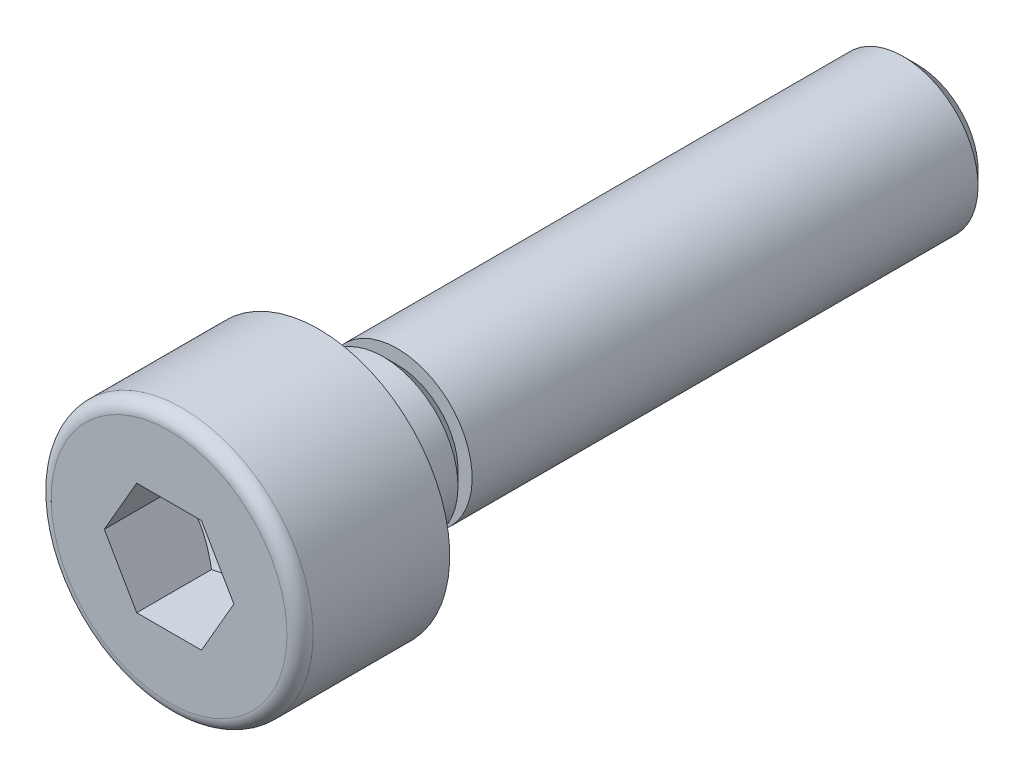
ISO-10303-21;
HEADER;
FILE_DESCRIPTION(('STEP AP214'),'2;1');
FILE_NAME('part.step','',(''),(''),'','','');
FILE_SCHEMA(('AUTOMOTIVE_DESIGN { 1 0 10303 214 1 1 1 1 }'));
ENDSEC;
DATA;
#1=APPLICATION_CONTEXT('core data for automotive mechanical design processes');
#2=APPLICATION_PROTOCOL_DEFINITION('international standard','automotive_design',2000,#1);
#3=PRODUCT_CONTEXT('',#1,'mechanical');
#4=PRODUCT('Part','Part','',(#3));
#5=PRODUCT_RELATED_PRODUCT_CATEGORY('part','',(#4));
#6=PRODUCT_DEFINITION_FORMATION('','',#4);
#7=PRODUCT_DEFINITION_CONTEXT('part definition',#1,'design');
#8=PRODUCT_DEFINITION('design','',#6,#7);
#9=PRODUCT_DEFINITION_SHAPE('','',#8);
#10=(LENGTH_UNIT() NAMED_UNIT(*) SI_UNIT(.MILLI.,.METRE.));
#11=(NAMED_UNIT(*) PLANE_ANGLE_UNIT() SI_UNIT($,.RADIAN.));
#12=(NAMED_UNIT(*) SI_UNIT($,.STERADIAN.) SOLID_ANGLE_UNIT());
#13=UNCERTAINTY_MEASURE_WITH_UNIT(LENGTH_MEASURE(1.E-05),#10,'distance_accuracy_value','');
#14=(GEOMETRIC_REPRESENTATION_CONTEXT(3) GLOBAL_UNCERTAINTY_ASSIGNED_CONTEXT((#13)) GLOBAL_UNIT_ASSIGNED_CONTEXT((#10,
#11,#12)) REPRESENTATION_CONTEXT('',''));
#15=CARTESIAN_POINT('',(0.,0.,0.));
#16=DIRECTION('',(0.,0.,1.));
#17=DIRECTION('',(1.,0.,0.));
#18=AXIS2_PLACEMENT_3D('',#15,#16,#17);
#19=CARTESIAN_POINT('',(0.,1.575,4.));
#20=DIRECTION('',(0.,0.,1.));
#21=DIRECTION('',(0.,-1.,0.));
#22=AXIS2_PLACEMENT_3D('',#19,#20,#21);
#23=PLANE('',#22);
#24=CARTESIAN_POINT('',(0.,0.,4.));
#25=DIRECTION('',(0.,0.,-1.));
#26=DIRECTION('',(0.,1.,0.));
#27=AXIS2_PLACEMENT_3D('',#24,#25,#26);
#28=CIRCLE('',#27,3.15);
#29=CARTESIAN_POINT('',(0.,3.15,4.));
#30=VERTEX_POINT('',#29);
#31=EDGE_CURVE('E186',#30,#30,#28,.T.);
#32=ORIENTED_EDGE('',*,*,#31,.F.);
#33=EDGE_LOOP('',(#32));
#34=FACE_BOUND('',#33,.T.);
#35=DIRECTION('',(-0.5,0.866025403784439,0.));
#36=VECTOR('',#35,1.);
#37=CARTESIAN_POINT('',(-1.64003500274012,-0.159374650312418,4.));
#38=LINE('',#37,#36);
#39=CARTESIAN_POINT('',(-0.866025,-1.49999930062484,4.));
#40=VERTEX_POINT('',#39);
#41=CARTESIAN_POINT('',(-1.73205,0.,4.));
#42=VERTEX_POINT('',#41);
#43=EDGE_CURVE('E100',#40,#42,#38,.T.);
#44=ORIENTED_EDGE('',*,*,#43,.T.);
#45=DIRECTION('',(0.5,0.866025403784439,0.));
#46=VECTOR('',#45,1.);
#47=CARTESIAN_POINT('',(-0.958039997259878,1.34062465031242,4.));
#48=LINE('',#47,#46);
#49=CARTESIAN_POINT('',(-0.866025,1.49999930062484,4.));
#50=VERTEX_POINT('',#49);
#51=EDGE_CURVE('E182',#42,#50,#48,.T.);
#52=ORIENTED_EDGE('',*,*,#51,.T.);
#53=DIRECTION('',(1.,0.,0.));
#54=VECTOR('',#53,1.);
#55=CARTESIAN_POINT('',(0.,1.49999930062484,4.));
#56=LINE('',#55,#54);
#57=CARTESIAN_POINT('',(0.866025,1.49999930062484,4.));
#58=VERTEX_POINT('',#57);
#59=EDGE_CURVE('E171',#50,#58,#56,.T.);
#60=ORIENTED_EDGE('',*,*,#59,.T.);
#61=DIRECTION('',(0.5,-0.866025403784439,0.));
#62=VECTOR('',#61,1.);
#63=CARTESIAN_POINT('',(0.958039997259877,1.34062465031242,4.));
#64=LINE('',#63,#62);
#65=CARTESIAN_POINT('',(1.73205,0.,4.));
#66=VERTEX_POINT('',#65);
#67=EDGE_CURVE('E178',#58,#66,#64,.T.);
#68=ORIENTED_EDGE('',*,*,#67,.T.);
#69=DIRECTION('',(-0.5,-0.866025403784439,0.));
#70=VECTOR('',#69,1.);
#71=CARTESIAN_POINT('',(1.64003500274012,-0.159374650312418,4.));
#72=LINE('',#71,#70);
#73=CARTESIAN_POINT('',(0.866025,-1.49999930062484,4.));
#74=VERTEX_POINT('',#73);
#75=EDGE_CURVE('E103',#66,#74,#72,.T.);
#76=ORIENTED_EDGE('',*,*,#75,.T.);
#77=DIRECTION('',(-1.,0.,0.));
#78=VECTOR('',#77,1.);
#79=CARTESIAN_POINT('',(0.,-1.49999930062484,4.));
#80=LINE('',#79,#78);
#81=EDGE_CURVE('E97',#74,#40,#80,.T.);
#82=ORIENTED_EDGE('',*,*,#81,.T.);
#83=EDGE_LOOP('',(#44,#52,#60,#68,#76,#82));
#84=FACE_BOUND('',#83,.T.);
#85=ADVANCED_FACE('F17',(#34,#84),#23,.T.);
#86=CARTESIAN_POINT('',(0.,0.8105625,-16.));
#87=DIRECTION('',(0.,0.,-1.));
#88=DIRECTION('',(0.,1.,0.));
#89=AXIS2_PLACEMENT_3D('',#86,#87,#88);
#90=PLANE('',#89);
#91=CARTESIAN_POINT('',(0.,0.,-16.));
#92=DIRECTION('',(0.,0.,-1.));
#93=DIRECTION('',(0.,1.,0.));
#94=AXIS2_PLACEMENT_3D('',#91,#92,#93);
#95=CIRCLE('',#94,1.621125);
#96=CARTESIAN_POINT('',(0.,1.621125,-16.));
#97=VERTEX_POINT('',#96);
#98=EDGE_CURVE('E11',#97,#97,#95,.T.);
#99=ORIENTED_EDGE('',*,*,#98,.T.);
#100=EDGE_LOOP('',(#99));
#101=FACE_BOUND('',#100,.T.);
#102=ADVANCED_FACE('F219',(#101),#90,.T.);
#103=CARTESIAN_POINT('',(0.,0.,-15.8105625));
#104=DIRECTION('',(0.,0.,1.));
#105=DIRECTION('',(0.,1.,0.));
#106=AXIS2_PLACEMENT_3D('',#103,#104,#105);
#107=CONICAL_SURFACE('',#106,1.8105625,0.785398163397448);
#108=CARTESIAN_POINT('',(0.,0.,-15.621125));
#109=DIRECTION('',(0.,0.,-1.));
#110=DIRECTION('',(0.,1.,0.));
#111=AXIS2_PLACEMENT_3D('',#108,#109,#110);
#112=CIRCLE('',#111,2.);
#113=CARTESIAN_POINT('',(0.,2.,-15.621125));
#114=VERTEX_POINT('',#113);
#115=EDGE_CURVE('E24',#114,#114,#112,.T.);
#116=ORIENTED_EDGE('',*,*,#115,.T.);
#117=EDGE_LOOP('',(#116));
#118=FACE_BOUND('',#117,.T.);
#119=ORIENTED_EDGE('',*,*,#98,.F.);
#120=EDGE_LOOP('',(#119));
#121=FACE_BOUND('',#120,.T.);
#122=ADVANCED_FACE('F224',(#118,#121),#107,.T.);
#123=CARTESIAN_POINT('',(0.,0.,-8.8605625));
#124=DIRECTION('',(0.,0.,1.));
#125=DIRECTION('',(0.,1.,0.));
#126=AXIS2_PLACEMENT_3D('',#123,#124,#125);
#127=CYLINDRICAL_SURFACE('',#126,2.);
#128=CARTESIAN_POINT('',(0.,0.,-2.1));
#129=DIRECTION('',(0.,0.,-1.));
#130=DIRECTION('',(0.,1.,0.));
#131=AXIS2_PLACEMENT_3D('',#128,#129,#130);
#132=CIRCLE('',#131,2.);
#133=CARTESIAN_POINT('',(0.,2.,-2.1));
#134=VERTEX_POINT('',#133);
#135=EDGE_CURVE('E123',#134,#134,#132,.T.);
#136=ORIENTED_EDGE('',*,*,#135,.T.);
#137=EDGE_LOOP('',(#136));
#138=FACE_BOUND('',#137,.T.);
#139=ORIENTED_EDGE('',*,*,#115,.F.);
#140=EDGE_LOOP('',(#139));
#141=FACE_BOUND('',#140,.T.);
#142=ADVANCED_FACE('F214',(#138,#141),#127,.T.);
#143=CARTESIAN_POINT('',(0.,1.8105625,-2.1));
#144=DIRECTION('',(0.,0.,1.));
#145=DIRECTION('',(0.,-1.,0.));
#146=AXIS2_PLACEMENT_3D('',#143,#144,#145);
#147=PLANE('',#146);
#148=CARTESIAN_POINT('',(0.,0.,-2.1));
#149=DIRECTION('',(0.,0.,-1.));
#150=DIRECTION('',(0.,1.,0.));
#151=AXIS2_PLACEMENT_3D('',#148,#149,#150);
#152=CIRCLE('',#151,1.621125);
#153=CARTESIAN_POINT('',(0.,1.621125,-2.1));
#154=VERTEX_POINT('',#153);
#155=EDGE_CURVE('E125',#154,#154,#152,.T.);
#156=ORIENTED_EDGE('',*,*,#155,.T.);
#157=EDGE_LOOP('',(#156));
#158=FACE_BOUND('',#157,.T.);
#159=ORIENTED_EDGE('',*,*,#135,.F.);
#160=EDGE_LOOP('',(#159));
#161=FACE_BOUND('',#160,.T.);
#162=ADVANCED_FACE('F198',(#158,#161),#147,.T.);
#163=CARTESIAN_POINT('',(0.,0.,-1.9105625));
#164=DIRECTION('',(0.,0.,1.));
#165=DIRECTION('',(0.,1.,0.));
#166=AXIS2_PLACEMENT_3D('',#163,#164,#165);
#167=CONICAL_SURFACE('',#166,1.8105625,0.785398163397449);
#168=CARTESIAN_POINT('',(0.,0.,-1.721125));
#169=DIRECTION('',(0.,0.,-1.));
#170=DIRECTION('',(0.,1.,0.));
#171=AXIS2_PLACEMENT_3D('',#168,#169,#170);
#172=CIRCLE('',#171,2.);
#173=CARTESIAN_POINT('',(0.,2.,-1.721125));
#174=VERTEX_POINT('',#173);
#175=EDGE_CURVE('E194',#174,#174,#172,.T.);
#176=ORIENTED_EDGE('',*,*,#175,.T.);
#177=EDGE_LOOP('',(#176));
#178=FACE_BOUND('',#177,.T.);
#179=ORIENTED_EDGE('',*,*,#155,.F.);
#180=EDGE_LOOP('',(#179));
#181=FACE_BOUND('',#180,.T.);
#182=ADVANCED_FACE('F201',(#178,#181),#167,.T.);
#183=CARTESIAN_POINT('',(0.,0.,-0.9605625));
#184=DIRECTION('',(0.,0.,1.));
#185=DIRECTION('',(0.,1.,0.));
#186=AXIS2_PLACEMENT_3D('',#183,#184,#185);
#187=CYLINDRICAL_SURFACE('',#186,2.);
#188=CARTESIAN_POINT('',(0.,0.,-0.2));
#189=DIRECTION('',(0.,0.,-1.));
#190=DIRECTION('',(0.,1.,0.));
#191=AXIS2_PLACEMENT_3D('',#188,#189,#190);
#192=CIRCLE('',#191,2.);
#193=CARTESIAN_POINT('',(0.,2.,-0.2));
#194=VERTEX_POINT('',#193);
#195=EDGE_CURVE('E192',#194,#194,#192,.T.);
#196=ORIENTED_EDGE('',*,*,#195,.T.);
#197=EDGE_LOOP('',(#196));
#198=FACE_BOUND('',#197,.T.);
#199=ORIENTED_EDGE('',*,*,#175,.F.);
#200=EDGE_LOOP('',(#199));
#201=FACE_BOUND('',#200,.T.);
#202=ADVANCED_FACE('F203',(#198,#201),#187,.T.);
#203=CARTESIAN_POINT('',(0.,0.,-0.2));
#204=DIRECTION('',(0.,0.,-1.));
#205=DIRECTION('',(-1.,0.,0.));
#206=AXIS2_PLACEMENT_3D('',#203,#204,#205);
#207=TOROIDAL_SURFACE('',#206,2.2,0.2);
#208=CARTESIAN_POINT('',(0.,0.,0.));
#209=DIRECTION('',(0.,0.,-1.));
#210=DIRECTION('',(0.,1.,0.));
#211=AXIS2_PLACEMENT_3D('',#208,#209,#210);
#212=CIRCLE('',#211,2.2);
#213=CARTESIAN_POINT('',(0.,2.2,0.));
#214=VERTEX_POINT('',#213);
#215=EDGE_CURVE('E190',#214,#214,#212,.T.);
#216=ORIENTED_EDGE('',*,*,#215,.T.);
#217=EDGE_LOOP('',(#216));
#218=FACE_BOUND('',#217,.T.);
#219=ORIENTED_EDGE('',*,*,#195,.F.);
#220=EDGE_LOOP('',(#219));
#221=FACE_BOUND('',#220,.T.);
#222=ADVANCED_FACE('F211',(#218,#221),#207,.F.);
#223=CARTESIAN_POINT('',(0.,2.85,0.));
#224=DIRECTION('',(0.,0.,-1.));
#225=DIRECTION('',(0.,1.,0.));
#226=AXIS2_PLACEMENT_3D('',#223,#224,#225);
#227=PLANE('',#226);
#228=CARTESIAN_POINT('',(0.,0.,0.));
#229=DIRECTION('',(0.,0.,-1.));
#230=DIRECTION('',(0.,1.,0.));
#231=AXIS2_PLACEMENT_3D('',#228,#229,#230);
#232=CIRCLE('',#231,3.5);
#233=CARTESIAN_POINT('',(0.,3.5,0.));
#234=VERTEX_POINT('',#233);
#235=EDGE_CURVE('E188',#234,#234,#232,.T.);
#236=ORIENTED_EDGE('',*,*,#235,.T.);
#237=EDGE_LOOP('',(#236));
#238=FACE_BOUND('',#237,.T.);
#239=ORIENTED_EDGE('',*,*,#215,.F.);
#240=EDGE_LOOP('',(#239));
#241=FACE_BOUND('',#240,.T.);
#242=ADVANCED_FACE('F237',(#238,#241),#227,.T.);
#243=CARTESIAN_POINT('',(0.,0.,1.825));
#244=DIRECTION('',(0.,0.,1.));
#245=DIRECTION('',(0.,1.,0.));
#246=AXIS2_PLACEMENT_3D('',#243,#244,#245);
#247=CYLINDRICAL_SURFACE('',#246,3.5);
#248=CARTESIAN_POINT('',(0.,0.,3.65));
#249=DIRECTION('',(0.,0.,-1.));
#250=DIRECTION('',(0.,1.,0.));
#251=AXIS2_PLACEMENT_3D('',#248,#249,#250);
#252=CIRCLE('',#251,3.5);
#253=CARTESIAN_POINT('',(0.,3.5,3.65));
#254=VERTEX_POINT('',#253);
#255=EDGE_CURVE('E184',#254,#254,#252,.T.);
#256=ORIENTED_EDGE('',*,*,#255,.T.);
#257=EDGE_LOOP('',(#256));
#258=FACE_BOUND('',#257,.T.);
#259=ORIENTED_EDGE('',*,*,#235,.F.);
#260=EDGE_LOOP('',(#259));
#261=FACE_BOUND('',#260,.T.);
#262=ADVANCED_FACE('F231',(#258,#261),#247,.T.);
#263=CARTESIAN_POINT('',(0.,0.,3.65));
#264=DIRECTION('',(0.,0.,-1.));
#265=DIRECTION('',(-1.,0.,0.));
#266=AXIS2_PLACEMENT_3D('',#263,#264,#265);
#267=TOROIDAL_SURFACE('',#266,3.15,0.35);
#268=ORIENTED_EDGE('',*,*,#31,.T.);
#269=EDGE_LOOP('',(#268));
#270=FACE_BOUND('',#269,.T.);
#271=ORIENTED_EDGE('',*,*,#255,.F.);
#272=EDGE_LOOP('',(#271));
#273=FACE_BOUND('',#272,.T.);
#274=ADVANCED_FACE('F227',(#270,#273),#267,.T.);
#275=CARTESIAN_POINT('',(-1.2990375,0.749999650312418,4.));
#276=DIRECTION('',(-0.866025403784439,0.5,0.));
#277=DIRECTION('',(0.5,0.866025403784439,0.));
#278=AXIS2_PLACEMENT_3D('',#275,#276,#277);
#279=PLANE('',#278);
#280=CARTESIAN_POINT('',(-1.73205,0.,2.));
#281=CARTESIAN_POINT('',(-1.2990375,0.749999650312417,1.75000011656253));
#282=CARTESIAN_POINT('',(-0.866025,1.49999930062484,2.));
#283=(BOUNDED_CURVE() B_SPLINE_CURVE(2,(#280,#281,#282),.UNSPECIFIED.,.F.,
.F.) B_SPLINE_CURVE_WITH_KNOTS((3,3),(0.,1.75265338994166),
.UNSPECIFIED.) CURVE() GEOMETRIC_REPRESENTATION_ITEM() RATIONAL_B_SPLINE_CURVE((1.,
1.15470053837925,1.)) REPRESENTATION_ITEM(''));
#284=CARTESIAN_POINT('',(-1.73205,0.,2.));
#285=VERTEX_POINT('',#284);
#286=CARTESIAN_POINT('',(-0.866025,1.49999930062484,2.));
#287=VERTEX_POINT('',#286);
#288=EDGE_CURVE('E145',#285,#287,#283,.T.);
#289=ORIENTED_EDGE('',*,*,#288,.T.);
#290=DIRECTION('',(0.,0.,-1.));
#291=VECTOR('',#290,1.);
#292=CARTESIAN_POINT('',(-0.866025,1.49999930062484,4.));
#293=LINE('',#292,#291);
#294=EDGE_CURVE('E172',#50,#287,#293,.T.);
#295=ORIENTED_EDGE('',*,*,#294,.F.);
#296=ORIENTED_EDGE('',*,*,#51,.F.);
#297=DIRECTION('',(0.,0.,-1.));
#298=VECTOR('',#297,1.);
#299=CARTESIAN_POINT('',(-1.73205,0.,4.));
#300=LINE('',#299,#298);
#301=EDGE_CURVE('E118',#42,#285,#300,.T.);
#302=ORIENTED_EDGE('',*,*,#301,.T.);
#303=EDGE_LOOP('',(#289,#295,#296,#302));
#304=FACE_BOUND('',#303,.T.);
#305=ADVANCED_FACE('F230',(#304),#279,.F.);
#306=CARTESIAN_POINT('',(0.,1.49999930062484,4.));
#307=DIRECTION('',(0.,1.,0.));
#308=DIRECTION('',(1.,0.,0.));
#309=AXIS2_PLACEMENT_3D('',#306,#307,#308);
#310=PLANE('',#309);
#311=CARTESIAN_POINT('',(-0.866025,1.49999930062484,2.));
#312=CARTESIAN_POINT('',(0.,1.49999930062483,1.75000011656253));
#313=CARTESIAN_POINT('',(0.866025,1.49999930062484,2.));
#314=(BOUNDED_CURVE() B_SPLINE_CURVE(2,(#311,#312,#313),.UNSPECIFIED.,.F.,
.F.) B_SPLINE_CURVE_WITH_KNOTS((3,3),(0.,1.75265338994166),
.UNSPECIFIED.) CURVE() GEOMETRIC_REPRESENTATION_ITEM() RATIONAL_B_SPLINE_CURVE((1.,
1.15470053837925,1.)) REPRESENTATION_ITEM(''));
#315=CARTESIAN_POINT('',(0.866025,1.49999930062484,2.));
#316=VERTEX_POINT('',#315);
#317=EDGE_CURVE('E131',#287,#316,#314,.T.);
#318=ORIENTED_EDGE('',*,*,#317,.T.);
#319=DIRECTION('',(0.,0.,-1.));
#320=VECTOR('',#319,1.);
#321=CARTESIAN_POINT('',(0.866025,1.49999930062484,4.));
#322=LINE('',#321,#320);
#323=EDGE_CURVE('E173',#58,#316,#322,.T.);
#324=ORIENTED_EDGE('',*,*,#323,.F.);
#325=ORIENTED_EDGE('',*,*,#59,.F.);
#326=ORIENTED_EDGE('',*,*,#294,.T.);
#327=EDGE_LOOP('',(#318,#324,#325,#326));
#328=FACE_BOUND('',#327,.T.);
#329=ADVANCED_FACE('F259',(#328),#310,.F.);
#330=CARTESIAN_POINT('',(1.2990375,0.749999650312418,4.));
#331=DIRECTION('',(0.866025403784439,0.5,0.));
#332=DIRECTION('',(0.5,-0.866025403784439,0.));
#333=AXIS2_PLACEMENT_3D('',#330,#331,#332);
#334=PLANE('',#333);
#335=CARTESIAN_POINT('',(0.866025,1.49999930062484,2.));
#336=CARTESIAN_POINT('',(1.2990375,0.749999650312418,1.75000011656253));
#337=CARTESIAN_POINT('',(1.73205,0.,2.));
#338=(BOUNDED_CURVE() B_SPLINE_CURVE(2,(#335,#336,#337),.UNSPECIFIED.,.F.,
.F.) B_SPLINE_CURVE_WITH_KNOTS((3,3),(0.,1.75265338994166),
.UNSPECIFIED.) CURVE() GEOMETRIC_REPRESENTATION_ITEM() RATIONAL_B_SPLINE_CURVE((1.,
1.15470053837925,1.)) REPRESENTATION_ITEM(''));
#339=CARTESIAN_POINT('',(1.73205,0.,2.));
#340=VERTEX_POINT('',#339);
#341=EDGE_CURVE('E126',#316,#340,#338,.T.);
#342=ORIENTED_EDGE('',*,*,#341,.T.);
#343=DIRECTION('',(0.,0.,-1.));
#344=VECTOR('',#343,1.);
#345=CARTESIAN_POINT('',(1.73205,0.,4.));
#346=LINE('',#345,#344);
#347=EDGE_CURVE('E176',#66,#340,#346,.T.);
#348=ORIENTED_EDGE('',*,*,#347,.F.);
#349=ORIENTED_EDGE('',*,*,#67,.F.);
#350=ORIENTED_EDGE('',*,*,#323,.T.);
#351=EDGE_LOOP('',(#342,#348,#349,#350));
#352=FACE_BOUND('',#351,.T.);
#353=ADVANCED_FACE('F257',(#352),#334,.F.);
#354=CARTESIAN_POINT('',(1.2990375,-0.749999650312419,4.));
#355=DIRECTION('',(0.866025403784439,-0.5,0.));
#356=DIRECTION('',(-0.5,-0.866025403784439,0.));
#357=AXIS2_PLACEMENT_3D('',#354,#355,#356);
#358=PLANE('',#357);
#359=CARTESIAN_POINT('',(1.73205,0.,2.));
#360=CARTESIAN_POINT('',(1.2990375,-0.749999650312419,1.75000011656253));
#361=CARTESIAN_POINT('',(0.866025,-1.49999930062484,2.));
#362=(BOUNDED_CURVE() B_SPLINE_CURVE(2,(#359,#360,#361),.UNSPECIFIED.,.F.,
.F.) B_SPLINE_CURVE_WITH_KNOTS((3,3),(0.,1.75265338994166),
.UNSPECIFIED.) CURVE() GEOMETRIC_REPRESENTATION_ITEM() RATIONAL_B_SPLINE_CURVE((1.,
1.15470053837925,1.)) REPRESENTATION_ITEM(''));
#363=CARTESIAN_POINT('',(0.866025,-1.49999930062484,2.));
#364=VERTEX_POINT('',#363);
#365=EDGE_CURVE('E120',#340,#364,#362,.T.);
#366=ORIENTED_EDGE('',*,*,#365,.T.);
#367=DIRECTION('',(0.,0.,-1.));
#368=VECTOR('',#367,1.);
#369=CARTESIAN_POINT('',(0.866025,-1.49999930062484,4.));
#370=LINE('',#369,#368);
#371=EDGE_CURVE('E106',#74,#364,#370,.T.);
#372=ORIENTED_EDGE('',*,*,#371,.F.);
#373=ORIENTED_EDGE('',*,*,#75,.F.);
#374=ORIENTED_EDGE('',*,*,#347,.T.);
#375=EDGE_LOOP('',(#366,#372,#373,#374));
#376=FACE_BOUND('',#375,.T.);
#377=ADVANCED_FACE('F256',(#376),#358,.F.);
#378=CARTESIAN_POINT('',(0.,-1.49999930062484,4.));
#379=DIRECTION('',(0.,-1.,0.));
#380=DIRECTION('',(-1.,0.,0.));
#381=AXIS2_PLACEMENT_3D('',#378,#379,#380);
#382=PLANE('',#381);
#383=CARTESIAN_POINT('',(0.866025,-1.49999930062484,2.));
#384=CARTESIAN_POINT('',(0.,-1.49999930062485,1.75000011656253));
#385=CARTESIAN_POINT('',(-0.866025,-1.49999930062484,2.));
#386=(BOUNDED_CURVE() B_SPLINE_CURVE(2,(#383,#384,#385),.UNSPECIFIED.,.F.,
.F.) B_SPLINE_CURVE_WITH_KNOTS((3,3),(0.,1.75265338994166),
.UNSPECIFIED.) CURVE() GEOMETRIC_REPRESENTATION_ITEM() RATIONAL_B_SPLINE_CURVE((1.,
1.15470053837924,1.)) REPRESENTATION_ITEM(''));
#387=CARTESIAN_POINT('',(-0.866025,-1.49999930062484,2.));
#388=VERTEX_POINT('',#387);
#389=EDGE_CURVE('E112',#364,#388,#386,.T.);
#390=ORIENTED_EDGE('',*,*,#389,.T.);
#391=DIRECTION('',(0.,0.,-1.));
#392=VECTOR('',#391,1.);
#393=CARTESIAN_POINT('',(-0.866025,-1.49999930062484,4.));
#394=LINE('',#393,#392);
#395=EDGE_CURVE('E107',#40,#388,#394,.T.);
#396=ORIENTED_EDGE('',*,*,#395,.F.);
#397=ORIENTED_EDGE('',*,*,#81,.F.);
#398=ORIENTED_EDGE('',*,*,#371,.T.);
#399=EDGE_LOOP('',(#390,#396,#397,#398));
#400=FACE_BOUND('',#399,.T.);
#401=ADVANCED_FACE('F110',(#400),#382,.F.);
#402=CARTESIAN_POINT('',(-1.2990375,-0.749999650312419,4.));
#403=DIRECTION('',(-0.866025403784439,-0.5,0.));
#404=DIRECTION('',(-0.5,0.866025403784439,0.));
#405=AXIS2_PLACEMENT_3D('',#402,#403,#404);
#406=PLANE('',#405);
#407=CARTESIAN_POINT('',(-0.866025,-1.49999930062484,2.));
#408=CARTESIAN_POINT('',(-1.2990375,-0.749999650312423,1.75000011656253));
#409=CARTESIAN_POINT('',(-1.73205,0.,2.));
#410=(BOUNDED_CURVE() B_SPLINE_CURVE(2,(#407,#408,#409),.UNSPECIFIED.,.F.,
.F.) B_SPLINE_CURVE_WITH_KNOTS((3,3),(0.,1.75265338994166),
.UNSPECIFIED.) CURVE() GEOMETRIC_REPRESENTATION_ITEM() RATIONAL_B_SPLINE_CURVE((1.,
1.15470053837924,1.)) REPRESENTATION_ITEM(''));
#411=EDGE_CURVE('E154',#388,#285,#410,.T.);
#412=ORIENTED_EDGE('',*,*,#411,.T.);
#413=ORIENTED_EDGE('',*,*,#301,.F.);
#414=ORIENTED_EDGE('',*,*,#43,.F.);
#415=ORIENTED_EDGE('',*,*,#395,.T.);
#416=EDGE_LOOP('',(#412,#413,#414,#415));
#417=FACE_BOUND('',#416,.T.);
#418=ADVANCED_FACE('F117',(#417),#406,.F.);
#419=CARTESIAN_POINT('',(0.,0.,1.50000023312505));
#420=DIRECTION('',(0.,0.,1.));
#421=DIRECTION('',(0.,1.,0.));
#422=AXIS2_PLACEMENT_3D('',#419,#420,#421);
#423=CONICAL_SURFACE('',#422,0.866025,1.0471975511966);
#424=CARTESIAN_POINT('',(0.,0.,1.00000046625011));
#425=VERTEX_POINT('',#424);
#426=VERTEX_LOOP('',#425);
#427=FACE_BOUND('',#426,.T.);
#428=ORIENTED_EDGE('',*,*,#341,.F.);
#429=ORIENTED_EDGE('',*,*,#317,.F.);
#430=ORIENTED_EDGE('',*,*,#288,.F.);
#431=ORIENTED_EDGE('',*,*,#411,.F.);
#432=ORIENTED_EDGE('',*,*,#389,.F.);
#433=ORIENTED_EDGE('',*,*,#365,.F.);
#434=EDGE_LOOP('',(#428,#429,#430,#431,#432,#433));
#435=FACE_BOUND('',#434,.T.);
#436=ADVANCED_FACE('F343',(#427,#435),#423,.F.);
#437=CLOSED_SHELL('',(#85,#102,#122,#142,#162,#182,#202,#222,#242,#262,#274,#305,#329,#353,#377,
#401,#418,#436));
#438=MANIFOLD_SOLID_BREP('B1',#437);
#439=ADVANCED_BREP_SHAPE_REPRESENTATION('',(#18,#438),#14);
#440=SHAPE_DEFINITION_REPRESENTATION(#9,#439);
ENDSEC;
END-ISO-10303-21;
